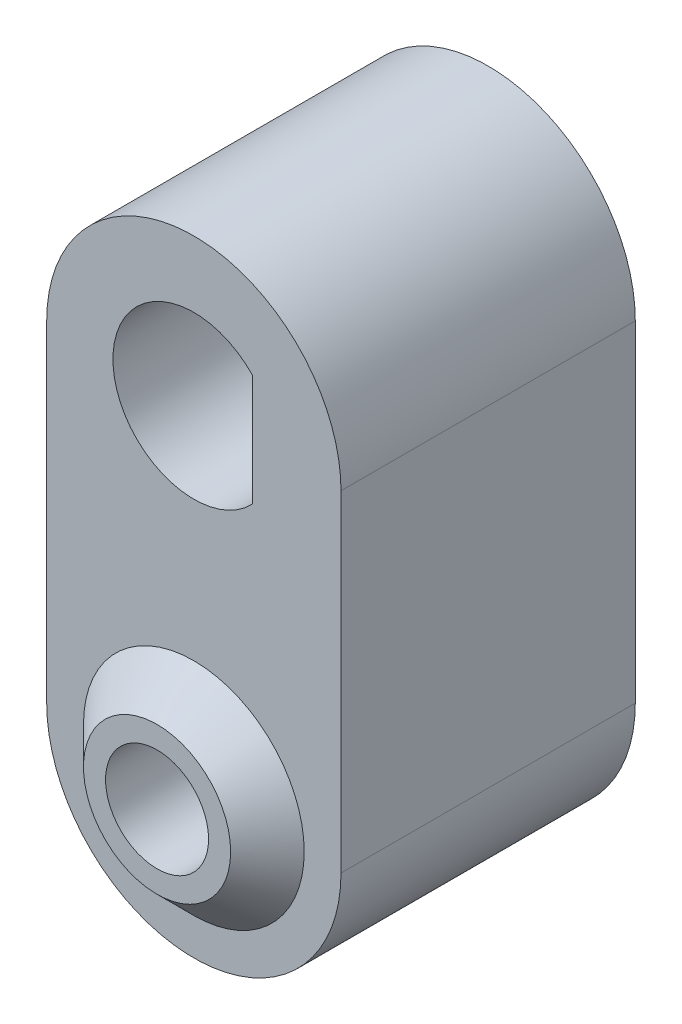
ISO-10303-21;
HEADER;
FILE_DESCRIPTION(('STEP AP214'),'2;1');
FILE_NAME('part.step','',(''),(''),'','','');
FILE_SCHEMA(('AUTOMOTIVE_DESIGN { 1 0 10303 214 1 1 1 1 }'));
ENDSEC;
DATA;
#1=APPLICATION_CONTEXT('core data for automotive mechanical design processes');
#2=APPLICATION_PROTOCOL_DEFINITION('international standard','automotive_design',2000,#1);
#3=PRODUCT_CONTEXT('',#1,'mechanical');
#4=PRODUCT('Part','Part','',(#3));
#5=PRODUCT_RELATED_PRODUCT_CATEGORY('part','',(#4));
#6=PRODUCT_DEFINITION_FORMATION('','',#4);
#7=PRODUCT_DEFINITION_CONTEXT('part definition',#1,'design');
#8=PRODUCT_DEFINITION('design','',#6,#7);
#9=PRODUCT_DEFINITION_SHAPE('','',#8);
#10=(LENGTH_UNIT() NAMED_UNIT(*) SI_UNIT(.MILLI.,.METRE.));
#11=(NAMED_UNIT(*) PLANE_ANGLE_UNIT() SI_UNIT($,.RADIAN.));
#12=(NAMED_UNIT(*) SI_UNIT($,.STERADIAN.) SOLID_ANGLE_UNIT());
#13=UNCERTAINTY_MEASURE_WITH_UNIT(LENGTH_MEASURE(1.E-05),#10,'distance_accuracy_value','');
#14=(GEOMETRIC_REPRESENTATION_CONTEXT(3) GLOBAL_UNCERTAINTY_ASSIGNED_CONTEXT((#13)) GLOBAL_UNIT_ASSIGNED_CONTEXT((#10,
#11,#12)) REPRESENTATION_CONTEXT('',''));
#15=CARTESIAN_POINT('',(0.,0.,0.));
#16=DIRECTION('',(0.,0.,1.));
#17=DIRECTION('',(1.,0.,0.));
#18=AXIS2_PLACEMENT_3D('',#15,#16,#17);
#19=CARTESIAN_POINT('',(0.,0.,8.));
#20=DIRECTION('',(0.,0.,1.));
#21=DIRECTION('',(1.,0.,0.));
#22=AXIS2_PLACEMENT_3D('',#19,#20,#21);
#23=PLANE('',#22);
#24=CARTESIAN_POINT('',(0.,-9.,8.));
#25=DIRECTION('',(0.,0.,1.));
#26=DIRECTION('',(1.,0.,0.));
#27=AXIS2_PLACEMENT_3D('',#24,#25,#26);
#28=CIRCLE('',#27,3.);
#29=CARTESIAN_POINT('',(3.,-9.,8.));
#30=VERTEX_POINT('',#29);
#31=EDGE_CURVE('E11',#30,#30,#28,.F.);
#32=ORIENTED_EDGE('',*,*,#31,.T.);
#33=EDGE_LOOP('',(#32));
#34=FACE_BOUND('',#33,.T.);
#35=CARTESIAN_POINT('',(0.,0.,8.));
#36=DIRECTION('',(0.,0.,1.));
#37=DIRECTION('',(1.,0.,0.));
#38=AXIS2_PLACEMENT_3D('',#35,#36,#37);
#39=CIRCLE('',#38,4.);
#40=CARTESIAN_POINT('',(4.,0.,8.));
#41=VERTEX_POINT('',#40);
#42=CARTESIAN_POINT('',(-4.,0.,8.));
#43=VERTEX_POINT('',#42);
#44=EDGE_CURVE('E113',#41,#43,#39,.T.);
#45=ORIENTED_EDGE('',*,*,#44,.T.);
#46=DIRECTION('',(0.,-1.,0.));
#47=VECTOR('',#46,1.);
#48=CARTESIAN_POINT('',(-4.,0.,8.));
#49=LINE('',#48,#47);
#50=CARTESIAN_POINT('',(-4.,-9.,8.));
#51=VERTEX_POINT('',#50);
#52=EDGE_CURVE('E116',#43,#51,#49,.T.);
#53=ORIENTED_EDGE('',*,*,#52,.T.);
#54=CARTESIAN_POINT('',(0.,-9.,8.));
#55=DIRECTION('',(0.,0.,1.));
#56=DIRECTION('',(1.,0.,0.));
#57=AXIS2_PLACEMENT_3D('',#54,#55,#56);
#58=CIRCLE('',#57,4.);
#59=CARTESIAN_POINT('',(4.,-9.,8.));
#60=VERTEX_POINT('',#59);
#61=EDGE_CURVE('E119',#51,#60,#58,.T.);
#62=ORIENTED_EDGE('',*,*,#61,.T.);
#63=DIRECTION('',(0.,-1.,0.));
#64=VECTOR('',#63,1.);
#65=CARTESIAN_POINT('',(4.,0.,8.));
#66=LINE('',#65,#64);
#67=EDGE_CURVE('E121',#41,#60,#66,.T.);
#68=ORIENTED_EDGE('',*,*,#67,.F.);
#69=EDGE_LOOP('',(#45,#53,#62,#68));
#70=FACE_BOUND('',#69,.T.);
#71=DIRECTION('',(0.,-1.,0.));
#72=VECTOR('',#71,1.);
#73=CARTESIAN_POINT('',(1.6,0.,8.));
#74=LINE('',#73,#72);
#75=CARTESIAN_POINT('',(1.6,1.50996688705415,8.));
#76=VERTEX_POINT('',#75);
#77=CARTESIAN_POINT('',(1.6,-1.50996688705415,8.));
#78=VERTEX_POINT('',#77);
#79=EDGE_CURVE('E53',#76,#78,#74,.T.);
#80=ORIENTED_EDGE('',*,*,#79,.T.);
#81=CARTESIAN_POINT('',(0.,0.,8.));
#82=DIRECTION('',(0.,0.,1.));
#83=DIRECTION('',(1.,0.,0.));
#84=AXIS2_PLACEMENT_3D('',#81,#82,#83);
#85=CIRCLE('',#84,2.2);
#86=EDGE_CURVE('E90',#76,#78,#85,.T.);
#87=ORIENTED_EDGE('',*,*,#86,.F.);
#88=EDGE_LOOP('',(#80,#87));
#89=FACE_BOUND('',#88,.T.);
#90=ADVANCED_FACE('F37',(#34,#70,#89),#23,.T.);
#91=CARTESIAN_POINT('',(0.,0.,0.));
#92=DIRECTION('',(0.,0.,1.));
#93=DIRECTION('',(1.,0.,0.));
#94=AXIS2_PLACEMENT_3D('',#91,#92,#93);
#95=PLANE('',#94);
#96=CARTESIAN_POINT('',(0.,0.,0.));
#97=DIRECTION('',(0.,0.,1.));
#98=DIRECTION('',(1.,0.,0.));
#99=AXIS2_PLACEMENT_3D('',#96,#97,#98);
#100=CIRCLE('',#99,4.);
#101=CARTESIAN_POINT('',(4.,0.,0.));
#102=VERTEX_POINT('',#101);
#103=CARTESIAN_POINT('',(-4.,0.,0.));
#104=VERTEX_POINT('',#103);
#105=EDGE_CURVE('E110',#102,#104,#100,.T.);
#106=ORIENTED_EDGE('',*,*,#105,.F.);
#107=DIRECTION('',(0.,-1.,0.));
#108=VECTOR('',#107,1.);
#109=CARTESIAN_POINT('',(4.,0.,0.));
#110=LINE('',#109,#108);
#111=CARTESIAN_POINT('',(4.,-9.,0.));
#112=VERTEX_POINT('',#111);
#113=EDGE_CURVE('E117',#102,#112,#110,.T.);
#114=ORIENTED_EDGE('',*,*,#113,.T.);
#115=CARTESIAN_POINT('',(0.,-9.,0.));
#116=DIRECTION('',(0.,0.,1.));
#117=DIRECTION('',(1.,0.,0.));
#118=AXIS2_PLACEMENT_3D('',#115,#116,#117);
#119=CIRCLE('',#118,4.);
#120=CARTESIAN_POINT('',(-4.,-9.,0.));
#121=VERTEX_POINT('',#120);
#122=EDGE_CURVE('E129',#121,#112,#119,.T.);
#123=ORIENTED_EDGE('',*,*,#122,.F.);
#124=DIRECTION('',(0.,-1.,0.));
#125=VECTOR('',#124,1.);
#126=CARTESIAN_POINT('',(-4.,0.,0.));
#127=LINE('',#126,#125);
#128=EDGE_CURVE('E127',#104,#121,#127,.T.);
#129=ORIENTED_EDGE('',*,*,#128,.F.);
#130=EDGE_LOOP('',(#106,#114,#123,#129));
#131=FACE_BOUND('',#130,.T.);
#132=CARTESIAN_POINT('',(0.,0.,0.));
#133=DIRECTION('',(0.,0.,1.));
#134=DIRECTION('',(1.,0.,0.));
#135=AXIS2_PLACEMENT_3D('',#132,#133,#134);
#136=CIRCLE('',#135,2.2);
#137=CARTESIAN_POINT('',(1.6,1.50996688705415,0.));
#138=VERTEX_POINT('',#137);
#139=CARTESIAN_POINT('',(1.6,-1.50996688705415,0.));
#140=VERTEX_POINT('',#139);
#141=EDGE_CURVE('E100',#138,#140,#136,.T.);
#142=ORIENTED_EDGE('',*,*,#141,.T.);
#143=DIRECTION('',(0.,-1.,0.));
#144=VECTOR('',#143,1.);
#145=CARTESIAN_POINT('',(1.6,0.,0.));
#146=LINE('',#145,#144);
#147=EDGE_CURVE('E58',#138,#140,#146,.T.);
#148=ORIENTED_EDGE('',*,*,#147,.F.);
#149=EDGE_LOOP('',(#142,#148));
#150=FACE_BOUND('',#149,.T.);
#151=CARTESIAN_POINT('',(0.,-9.,0.));
#152=DIRECTION('',(0.,0.,1.));
#153=DIRECTION('',(1.,0.,0.));
#154=AXIS2_PLACEMENT_3D('',#151,#152,#153);
#155=CIRCLE('',#154,1.4);
#156=CARTESIAN_POINT('',(1.4,-9.,0.));
#157=VERTEX_POINT('',#156);
#158=EDGE_CURVE('E107',#157,#157,#155,.T.);
#159=ORIENTED_EDGE('',*,*,#158,.T.);
#160=EDGE_LOOP('',(#159));
#161=FACE_BOUND('',#160,.T.);
#162=ADVANCED_FACE('F150',(#131,#150,#161),#95,.F.);
#163=CARTESIAN_POINT('',(0.,0.,8.));
#164=DIRECTION('',(0.,0.,-1.));
#165=DIRECTION('',(-1.,0.,0.));
#166=AXIS2_PLACEMENT_3D('',#163,#164,#165);
#167=CYLINDRICAL_SURFACE('',#166,4.);
#168=ORIENTED_EDGE('',*,*,#105,.T.);
#169=DIRECTION('',(0.,0.,-1.));
#170=VECTOR('',#169,1.);
#171=CARTESIAN_POINT('',(-4.,0.,8.));
#172=LINE('',#171,#170);
#173=EDGE_CURVE('E46',#43,#104,#172,.T.);
#174=ORIENTED_EDGE('',*,*,#173,.F.);
#175=ORIENTED_EDGE('',*,*,#44,.F.);
#176=DIRECTION('',(0.,0.,-1.));
#177=VECTOR('',#176,1.);
#178=CARTESIAN_POINT('',(4.,0.,8.));
#179=LINE('',#178,#177);
#180=EDGE_CURVE('E124',#41,#102,#179,.T.);
#181=ORIENTED_EDGE('',*,*,#180,.T.);
#182=EDGE_LOOP('',(#168,#174,#175,#181));
#183=FACE_BOUND('',#182,.T.);
#184=ADVANCED_FACE('F147',(#183),#167,.T.);
#185=CARTESIAN_POINT('',(-4.,0.,8.));
#186=DIRECTION('',(1.,0.,0.));
#187=DIRECTION('',(0.,1.,0.));
#188=AXIS2_PLACEMENT_3D('',#185,#186,#187);
#189=PLANE('',#188);
#190=ORIENTED_EDGE('',*,*,#128,.T.);
#191=DIRECTION('',(0.,0.,-1.));
#192=VECTOR('',#191,1.);
#193=CARTESIAN_POINT('',(-4.,-9.,8.));
#194=LINE('',#193,#192);
#195=EDGE_CURVE('E137',#51,#121,#194,.T.);
#196=ORIENTED_EDGE('',*,*,#195,.F.);
#197=ORIENTED_EDGE('',*,*,#52,.F.);
#198=ORIENTED_EDGE('',*,*,#173,.T.);
#199=EDGE_LOOP('',(#190,#196,#197,#198));
#200=FACE_BOUND('',#199,.T.);
#201=ADVANCED_FACE('F142',(#200),#189,.F.);
#202=CARTESIAN_POINT('',(0.,-9.,8.));
#203=DIRECTION('',(0.,0.,-1.));
#204=DIRECTION('',(-1.,0.,0.));
#205=AXIS2_PLACEMENT_3D('',#202,#203,#204);
#206=CYLINDRICAL_SURFACE('',#205,4.);
#207=ORIENTED_EDGE('',*,*,#122,.T.);
#208=DIRECTION('',(0.,0.,-1.));
#209=VECTOR('',#208,1.);
#210=CARTESIAN_POINT('',(4.,-9.,8.));
#211=LINE('',#210,#209);
#212=EDGE_CURVE('E135',#60,#112,#211,.T.);
#213=ORIENTED_EDGE('',*,*,#212,.F.);
#214=ORIENTED_EDGE('',*,*,#61,.F.);
#215=ORIENTED_EDGE('',*,*,#195,.T.);
#216=EDGE_LOOP('',(#207,#213,#214,#215));
#217=FACE_BOUND('',#216,.T.);
#218=ADVANCED_FACE('F159',(#217),#206,.T.);
#219=CARTESIAN_POINT('',(4.,0.,8.));
#220=DIRECTION('',(1.,0.,0.));
#221=DIRECTION('',(0.,1.,0.));
#222=AXIS2_PLACEMENT_3D('',#219,#220,#221);
#223=PLANE('',#222);
#224=ORIENTED_EDGE('',*,*,#113,.F.);
#225=ORIENTED_EDGE('',*,*,#180,.F.);
#226=ORIENTED_EDGE('',*,*,#67,.T.);
#227=ORIENTED_EDGE('',*,*,#212,.T.);
#228=EDGE_LOOP('',(#224,#225,#226,#227));
#229=FACE_BOUND('',#228,.T.);
#230=ADVANCED_FACE('F154',(#229),#223,.T.);
#231=CARTESIAN_POINT('',(0.,-9.,8.));
#232=DIRECTION('',(0.,0.,-1.));
#233=DIRECTION('',(-1.,0.,0.));
#234=AXIS2_PLACEMENT_3D('',#231,#232,#233);
#235=CYLINDRICAL_SURFACE('',#234,1.4);
#236=ORIENTED_EDGE('',*,*,#158,.F.);
#237=EDGE_LOOP('',(#236));
#238=FACE_BOUND('',#237,.T.);
#239=CARTESIAN_POINT('',(0.,-9.,9.));
#240=DIRECTION('',(0.,0.,1.));
#241=DIRECTION('',(1.,0.,0.));
#242=AXIS2_PLACEMENT_3D('',#239,#240,#241);
#243=CIRCLE('',#242,1.4);
#244=CARTESIAN_POINT('',(1.4,-9.,9.));
#245=VERTEX_POINT('',#244);
#246=EDGE_CURVE('E261',#245,#245,#243,.T.);
#247=ORIENTED_EDGE('',*,*,#246,.T.);
#248=EDGE_LOOP('',(#247));
#249=FACE_BOUND('',#248,.T.);
#250=ADVANCED_FACE('F169',(#238,#249),#235,.F.);
#251=CARTESIAN_POINT('',(1.6,0.,8.));
#252=DIRECTION('',(1.,0.,0.));
#253=DIRECTION('',(0.,0.,-1.));
#254=AXIS2_PLACEMENT_3D('',#251,#252,#253);
#255=PLANE('',#254);
#256=ORIENTED_EDGE('',*,*,#147,.T.);
#257=DIRECTION('',(0.,0.,-1.));
#258=VECTOR('',#257,1.);
#259=CARTESIAN_POINT('',(1.6,-1.50996688705415,8.));
#260=LINE('',#259,#258);
#261=EDGE_CURVE('E93',#78,#140,#260,.T.);
#262=ORIENTED_EDGE('',*,*,#261,.F.);
#263=ORIENTED_EDGE('',*,*,#79,.F.);
#264=DIRECTION('',(0.,0.,-1.));
#265=VECTOR('',#264,1.);
#266=CARTESIAN_POINT('',(1.6,1.50996688705415,8.));
#267=LINE('',#266,#265);
#268=EDGE_CURVE('E95',#76,#138,#267,.T.);
#269=ORIENTED_EDGE('',*,*,#268,.T.);
#270=EDGE_LOOP('',(#256,#262,#263,#269));
#271=FACE_BOUND('',#270,.T.);
#272=ADVANCED_FACE('F98',(#271),#255,.F.);
#273=CARTESIAN_POINT('',(0.,0.,8.));
#274=DIRECTION('',(0.,0.,-1.));
#275=DIRECTION('',(-1.,0.,0.));
#276=AXIS2_PLACEMENT_3D('',#273,#274,#275);
#277=CYLINDRICAL_SURFACE('',#276,2.2);
#278=ORIENTED_EDGE('',*,*,#141,.F.);
#279=ORIENTED_EDGE('',*,*,#268,.F.);
#280=ORIENTED_EDGE('',*,*,#86,.T.);
#281=ORIENTED_EDGE('',*,*,#261,.T.);
#282=EDGE_LOOP('',(#278,#279,#280,#281));
#283=FACE_BOUND('',#282,.T.);
#284=ADVANCED_FACE('F92',(#283),#277,.F.);
#285=CARTESIAN_POINT('',(0.,0.,9.));
#286=DIRECTION('',(0.,0.,1.));
#287=DIRECTION('',(1.,0.,0.));
#288=AXIS2_PLACEMENT_3D('',#285,#286,#287);
#289=PLANE('',#288);
#290=ORIENTED_EDGE('',*,*,#246,.F.);
#291=EDGE_LOOP('',(#290));
#292=FACE_BOUND('',#291,.T.);
#293=CARTESIAN_POINT('',(0.,-9.,9.));
#294=DIRECTION('',(0.,0.,1.));
#295=DIRECTION('',(1.,0.,0.));
#296=AXIS2_PLACEMENT_3D('',#293,#294,#295);
#297=CIRCLE('',#296,2.);
#298=CARTESIAN_POINT('',(2.,-9.,9.));
#299=VERTEX_POINT('',#298);
#300=EDGE_CURVE('E104',#299,#299,#297,.T.);
#301=ORIENTED_EDGE('',*,*,#300,.T.);
#302=EDGE_LOOP('',(#301));
#303=FACE_BOUND('',#302,.T.);
#304=ADVANCED_FACE('F212',(#292,#303),#289,.T.);
#305=CARTESIAN_POINT('',(0.,-9.,8.));
#306=DIRECTION('',(0.,0.,-1.));
#307=DIRECTION('',(-1.,0.,0.));
#308=AXIS2_PLACEMENT_3D('',#305,#306,#307);
#309=CONICAL_SURFACE('',#308,3.,0.785398163397453);
#310=ORIENTED_EDGE('',*,*,#300,.F.);
#311=EDGE_LOOP('',(#310));
#312=FACE_BOUND('',#311,.T.);
#313=ORIENTED_EDGE('',*,*,#31,.F.);
#314=EDGE_LOOP('',(#313));
#315=FACE_BOUND('',#314,.T.);
#316=ADVANCED_FACE('F40',(#312,#315),#309,.T.);
#317=CLOSED_SHELL('',(#90,#162,#184,#201,#218,#230,#250,#272,#284,#304,#316));
#318=MANIFOLD_SOLID_BREP('B2',#317);
#319=ADVANCED_BREP_SHAPE_REPRESENTATION('',(#18,#318),#14);
#320=SHAPE_DEFINITION_REPRESENTATION(#9,#319);
ENDSEC;
END-ISO-10303-21;
